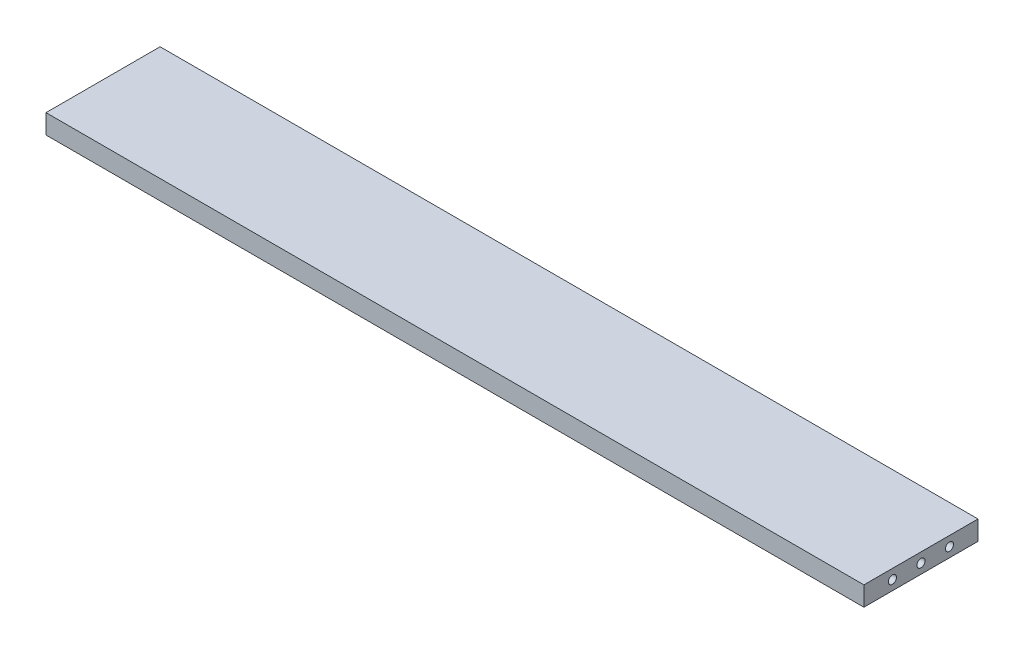
ISO-10303-21;
HEADER;
FILE_DESCRIPTION(('STEP AP214'),'2;1');
FILE_NAME('part.step','',(''),(''),'','','');
FILE_SCHEMA(('AUTOMOTIVE_DESIGN { 1 0 10303 214 1 1 1 1 }'));
ENDSEC;
DATA;
#1=APPLICATION_CONTEXT('core data for automotive mechanical design processes');
#2=APPLICATION_PROTOCOL_DEFINITION('international standard','automotive_design',2000,#1);
#3=PRODUCT_CONTEXT('',#1,'mechanical');
#4=PRODUCT('Part','Part','',(#3));
#5=PRODUCT_RELATED_PRODUCT_CATEGORY('part','',(#4));
#6=PRODUCT_DEFINITION_FORMATION('','',#4);
#7=PRODUCT_DEFINITION_CONTEXT('part definition',#1,'design');
#8=PRODUCT_DEFINITION('design','',#6,#7);
#9=PRODUCT_DEFINITION_SHAPE('','',#8);
#10=(LENGTH_UNIT() NAMED_UNIT(*) SI_UNIT(.MILLI.,.METRE.));
#11=(NAMED_UNIT(*) PLANE_ANGLE_UNIT() SI_UNIT($,.RADIAN.));
#12=(NAMED_UNIT(*) SI_UNIT($,.STERADIAN.) SOLID_ANGLE_UNIT());
#13=UNCERTAINTY_MEASURE_WITH_UNIT(LENGTH_MEASURE(1.E-05),#10,'distance_accuracy_value','');
#14=(GEOMETRIC_REPRESENTATION_CONTEXT(3) GLOBAL_UNCERTAINTY_ASSIGNED_CONTEXT((#13)) GLOBAL_UNIT_ASSIGNED_CONTEXT((#10,
#11,#12)) REPRESENTATION_CONTEXT('',''));
#15=CARTESIAN_POINT('',(0.,0.,0.));
#16=DIRECTION('',(0.,0.,1.));
#17=DIRECTION('',(1.,0.,0.));
#18=AXIS2_PLACEMENT_3D('',#15,#16,#17);
#19=CARTESIAN_POINT('',(-200.715,9.525,-28.));
#20=DIRECTION('',(1.,0.,0.));
#21=DIRECTION('',(0.,0.,-1.));
#22=AXIS2_PLACEMENT_3D('',#19,#20,#21);
#23=PLANE('',#22);
#24=CARTESIAN_POINT('',(-200.715,4.7625,14.));
#25=DIRECTION('',(-1.,0.,0.));
#26=DIRECTION('',(0.,0.,1.));
#27=AXIS2_PLACEMENT_3D('',#24,#25,#26);
#28=CIRCLE('',#27,2.);
#29=CARTESIAN_POINT('',(-200.715,4.7625,16.));
#30=VERTEX_POINT('',#29);
#31=EDGE_CURVE('E138',#30,#30,#28,.T.);
#32=ORIENTED_EDGE('',*,*,#31,.F.);
#33=EDGE_LOOP('',(#32));
#34=FACE_BOUND('',#33,.T.);
#35=CARTESIAN_POINT('',(-200.715,4.7625,0.));
#36=DIRECTION('',(-1.,0.,0.));
#37=DIRECTION('',(0.,0.,1.));
#38=AXIS2_PLACEMENT_3D('',#35,#36,#37);
#39=CIRCLE('',#38,2.);
#40=CARTESIAN_POINT('',(-200.715,4.7625,2.00000000000001));
#41=VERTEX_POINT('',#40);
#42=EDGE_CURVE('E132',#41,#41,#39,.T.);
#43=ORIENTED_EDGE('',*,*,#42,.F.);
#44=EDGE_LOOP('',(#43));
#45=FACE_BOUND('',#44,.T.);
#46=CARTESIAN_POINT('',(-200.715,4.7625,-14.));
#47=DIRECTION('',(-1.,0.,0.));
#48=DIRECTION('',(0.,0.,1.));
#49=AXIS2_PLACEMENT_3D('',#46,#47,#48);
#50=CIRCLE('',#49,2.);
#51=CARTESIAN_POINT('',(-200.715,4.7625,-12.));
#52=VERTEX_POINT('',#51);
#53=EDGE_CURVE('E126',#52,#52,#50,.T.);
#54=ORIENTED_EDGE('',*,*,#53,.F.);
#55=EDGE_LOOP('',(#54));
#56=FACE_BOUND('',#55,.T.);
#57=DIRECTION('',(0.,0.,1.));
#58=VECTOR('',#57,1.);
#59=CARTESIAN_POINT('',(-200.715,0.,-28.));
#60=LINE('',#59,#58);
#61=CARTESIAN_POINT('',(-200.715,0.,-28.));
#62=VERTEX_POINT('',#61);
#63=CARTESIAN_POINT('',(-200.715,0.,28.));
#64=VERTEX_POINT('',#63);
#65=EDGE_CURVE('E94',#62,#64,#60,.T.);
#66=ORIENTED_EDGE('',*,*,#65,.T.);
#67=DIRECTION('',(0.,-1.,0.));
#68=VECTOR('',#67,1.);
#69=CARTESIAN_POINT('',(-200.715,9.525,28.));
#70=LINE('',#69,#68);
#71=CARTESIAN_POINT('',(-200.715,9.525,28.));
#72=VERTEX_POINT('',#71);
#73=EDGE_CURVE('E11',#72,#64,#70,.T.);
#74=ORIENTED_EDGE('',*,*,#73,.F.);
#75=DIRECTION('',(0.,0.,1.));
#76=VECTOR('',#75,1.);
#77=CARTESIAN_POINT('',(-200.715,9.525,-28.));
#78=LINE('',#77,#76);
#79=CARTESIAN_POINT('',(-200.715,9.525,-28.));
#80=VERTEX_POINT('',#79);
#81=EDGE_CURVE('E82',#80,#72,#78,.T.);
#82=ORIENTED_EDGE('',*,*,#81,.F.);
#83=DIRECTION('',(0.,-1.,0.));
#84=VECTOR('',#83,1.);
#85=CARTESIAN_POINT('',(-200.715,9.525,-28.));
#86=LINE('',#85,#84);
#87=EDGE_CURVE('E90',#80,#62,#86,.T.);
#88=ORIENTED_EDGE('',*,*,#87,.T.);
#89=EDGE_LOOP('',(#66,#74,#82,#88));
#90=FACE_BOUND('',#89,.T.);
#91=ADVANCED_FACE('F31',(#34,#45,#56,#90),#23,.F.);
#92=CARTESIAN_POINT('',(-200.715,9.525,28.));
#93=DIRECTION('',(0.,0.,-1.));
#94=DIRECTION('',(-1.,0.,0.));
#95=AXIS2_PLACEMENT_3D('',#92,#93,#94);
#96=PLANE('',#95);
#97=DIRECTION('',(1.,0.,0.));
#98=VECTOR('',#97,1.);
#99=CARTESIAN_POINT('',(-200.715,0.,28.));
#100=LINE('',#99,#98);
#101=CARTESIAN_POINT('',(200.715,0.,28.));
#102=VERTEX_POINT('',#101);
#103=EDGE_CURVE('E86',#64,#102,#100,.T.);
#104=ORIENTED_EDGE('',*,*,#103,.T.);
#105=DIRECTION('',(0.,-1.,0.));
#106=VECTOR('',#105,1.);
#107=CARTESIAN_POINT('',(200.715,9.525,28.));
#108=LINE('',#107,#106);
#109=CARTESIAN_POINT('',(200.715,9.525,28.));
#110=VERTEX_POINT('',#109);
#111=EDGE_CURVE('E39',#110,#102,#108,.T.);
#112=ORIENTED_EDGE('',*,*,#111,.F.);
#113=DIRECTION('',(1.,0.,0.));
#114=VECTOR('',#113,1.);
#115=CARTESIAN_POINT('',(-200.715,9.525,28.));
#116=LINE('',#115,#114);
#117=EDGE_CURVE('E77',#72,#110,#116,.T.);
#118=ORIENTED_EDGE('',*,*,#117,.F.);
#119=ORIENTED_EDGE('',*,*,#73,.T.);
#120=EDGE_LOOP('',(#104,#112,#118,#119));
#121=FACE_BOUND('',#120,.T.);
#122=ADVANCED_FACE('F85',(#121),#96,.F.);
#123=CARTESIAN_POINT('',(200.715,9.525,-28.));
#124=DIRECTION('',(-1.,0.,0.));
#125=DIRECTION('',(0.,0.,1.));
#126=AXIS2_PLACEMENT_3D('',#123,#124,#125);
#127=PLANE('',#126);
#128=CARTESIAN_POINT('',(200.715,4.7625,-14.));
#129=DIRECTION('',(1.,0.,0.));
#130=DIRECTION('',(0.,0.,-1.));
#131=AXIS2_PLACEMENT_3D('',#128,#129,#130);
#132=CIRCLE('',#131,2.);
#133=CARTESIAN_POINT('',(200.715,4.7625,-16.));
#134=VERTEX_POINT('',#133);
#135=EDGE_CURVE('E120',#134,#134,#132,.T.);
#136=ORIENTED_EDGE('',*,*,#135,.F.);
#137=EDGE_LOOP('',(#136));
#138=FACE_BOUND('',#137,.T.);
#139=CARTESIAN_POINT('',(200.715,4.7625,0.));
#140=DIRECTION('',(1.,0.,0.));
#141=DIRECTION('',(0.,0.,-1.));
#142=AXIS2_PLACEMENT_3D('',#139,#140,#141);
#143=CIRCLE('',#142,2.);
#144=CARTESIAN_POINT('',(200.715,4.7625,-1.99999999999999));
#145=VERTEX_POINT('',#144);
#146=EDGE_CURVE('E114',#145,#145,#143,.T.);
#147=ORIENTED_EDGE('',*,*,#146,.F.);
#148=EDGE_LOOP('',(#147));
#149=FACE_BOUND('',#148,.T.);
#150=CARTESIAN_POINT('',(200.715,4.7625,14.));
#151=DIRECTION('',(1.,0.,0.));
#152=DIRECTION('',(0.,0.,-1.));
#153=AXIS2_PLACEMENT_3D('',#150,#151,#152);
#154=CIRCLE('',#153,2.);
#155=CARTESIAN_POINT('',(200.715,4.7625,12.));
#156=VERTEX_POINT('',#155);
#157=EDGE_CURVE('E108',#156,#156,#154,.T.);
#158=ORIENTED_EDGE('',*,*,#157,.F.);
#159=EDGE_LOOP('',(#158));
#160=FACE_BOUND('',#159,.T.);
#161=DIRECTION('',(0.,0.,-1.));
#162=VECTOR('',#161,1.);
#163=CARTESIAN_POINT('',(200.715,0.,-28.));
#164=LINE('',#163,#162);
#165=CARTESIAN_POINT('',(200.715,0.,-28.));
#166=VERTEX_POINT('',#165);
#167=EDGE_CURVE('E64',#102,#166,#164,.T.);
#168=ORIENTED_EDGE('',*,*,#167,.T.);
#169=DIRECTION('',(0.,-1.,0.));
#170=VECTOR('',#169,1.);
#171=CARTESIAN_POINT('',(200.715,9.525,-28.));
#172=LINE('',#171,#170);
#173=CARTESIAN_POINT('',(200.715,9.525,-28.));
#174=VERTEX_POINT('',#173);
#175=EDGE_CURVE('E87',#174,#166,#172,.T.);
#176=ORIENTED_EDGE('',*,*,#175,.F.);
#177=DIRECTION('',(0.,0.,-1.));
#178=VECTOR('',#177,1.);
#179=CARTESIAN_POINT('',(200.715,9.525,-28.));
#180=LINE('',#179,#178);
#181=EDGE_CURVE('E80',#110,#174,#180,.T.);
#182=ORIENTED_EDGE('',*,*,#181,.F.);
#183=ORIENTED_EDGE('',*,*,#111,.T.);
#184=EDGE_LOOP('',(#168,#176,#182,#183));
#185=FACE_BOUND('',#184,.T.);
#186=ADVANCED_FACE('F88',(#138,#149,#160,#185),#127,.F.);
#187=CARTESIAN_POINT('',(-200.715,9.525,-28.));
#188=DIRECTION('',(0.,0.,1.));
#189=DIRECTION('',(1.,0.,0.));
#190=AXIS2_PLACEMENT_3D('',#187,#188,#189);
#191=PLANE('',#190);
#192=DIRECTION('',(-1.,0.,0.));
#193=VECTOR('',#192,1.);
#194=CARTESIAN_POINT('',(-200.715,0.,-28.));
#195=LINE('',#194,#193);
#196=EDGE_CURVE('E70',#166,#62,#195,.T.);
#197=ORIENTED_EDGE('',*,*,#196,.T.);
#198=ORIENTED_EDGE('',*,*,#87,.F.);
#199=DIRECTION('',(-1.,0.,0.));
#200=VECTOR('',#199,1.);
#201=CARTESIAN_POINT('',(-200.715,9.525,-28.));
#202=LINE('',#201,#200);
#203=EDGE_CURVE('E47',#174,#80,#202,.T.);
#204=ORIENTED_EDGE('',*,*,#203,.F.);
#205=ORIENTED_EDGE('',*,*,#175,.T.);
#206=EDGE_LOOP('',(#197,#198,#204,#205));
#207=FACE_BOUND('',#206,.T.);
#208=ADVANCED_FACE('F102',(#207),#191,.F.);
#209=CARTESIAN_POINT('',(-200.715,9.525,28.));
#210=DIRECTION('',(0.,1.,0.));
#211=DIRECTION('',(0.,0.,1.));
#212=AXIS2_PLACEMENT_3D('',#209,#210,#211);
#213=PLANE('',#212);
#214=ORIENTED_EDGE('',*,*,#81,.T.);
#215=ORIENTED_EDGE('',*,*,#117,.T.);
#216=ORIENTED_EDGE('',*,*,#181,.T.);
#217=ORIENTED_EDGE('',*,*,#203,.T.);
#218=EDGE_LOOP('',(#214,#215,#216,#217));
#219=FACE_BOUND('',#218,.T.);
#220=ADVANCED_FACE('F78',(#219),#213,.T.);
#221=CARTESIAN_POINT('',(-200.715,0.,28.));
#222=DIRECTION('',(0.,1.,0.));
#223=DIRECTION('',(0.,0.,1.));
#224=AXIS2_PLACEMENT_3D('',#221,#222,#223);
#225=PLANE('',#224);
#226=ORIENTED_EDGE('',*,*,#65,.F.);
#227=ORIENTED_EDGE('',*,*,#196,.F.);
#228=ORIENTED_EDGE('',*,*,#167,.F.);
#229=ORIENTED_EDGE('',*,*,#103,.F.);
#230=EDGE_LOOP('',(#226,#227,#228,#229));
#231=FACE_BOUND('',#230,.T.);
#232=ADVANCED_FACE('F105',(#231),#225,.F.);
#233=CARTESIAN_POINT('',(170.715,4.7625,14.));
#234=DIRECTION('',(1.,0.,0.));
#235=DIRECTION('',(0.,0.,-1.));
#236=AXIS2_PLACEMENT_3D('',#233,#234,#235);
#237=CYLINDRICAL_SURFACE('',#236,2.);
#238=CARTESIAN_POINT('',(170.715,4.7625,14.));
#239=DIRECTION('',(1.,0.,0.));
#240=DIRECTION('',(0.,0.,-1.));
#241=AXIS2_PLACEMENT_3D('',#238,#239,#240);
#242=CIRCLE('',#241,2.);
#243=CARTESIAN_POINT('',(170.715,4.7625,12.));
#244=VERTEX_POINT('',#243);
#245=EDGE_CURVE('E97',#244,#244,#242,.T.);
#246=ORIENTED_EDGE('',*,*,#245,.F.);
#247=EDGE_LOOP('',(#246));
#248=FACE_BOUND('',#247,.T.);
#249=ORIENTED_EDGE('',*,*,#157,.T.);
#250=EDGE_LOOP('',(#249));
#251=FACE_BOUND('',#250,.T.);
#252=ADVANCED_FACE('F192',(#248,#251),#237,.F.);
#253=CARTESIAN_POINT('',(170.715,4.7625,14.));
#254=DIRECTION('',(1.,0.,0.));
#255=DIRECTION('',(0.,0.,-1.));
#256=AXIS2_PLACEMENT_3D('',#253,#254,#255);
#257=PLANE('',#256);
#258=ORIENTED_EDGE('',*,*,#245,.T.);
#259=EDGE_LOOP('',(#258));
#260=FACE_BOUND('',#259,.T.);
#261=ADVANCED_FACE('F188',(#260),#257,.T.);
#262=CARTESIAN_POINT('',(170.715,4.7625,0.));
#263=DIRECTION('',(1.,0.,0.));
#264=DIRECTION('',(0.,0.,-1.));
#265=AXIS2_PLACEMENT_3D('',#262,#263,#264);
#266=CYLINDRICAL_SURFACE('',#265,2.);
#267=CARTESIAN_POINT('',(170.715,4.7625,0.));
#268=DIRECTION('',(1.,0.,0.));
#269=DIRECTION('',(0.,0.,-1.));
#270=AXIS2_PLACEMENT_3D('',#267,#268,#269);
#271=CIRCLE('',#270,2.);
#272=CARTESIAN_POINT('',(170.715,4.7625,-1.99999999999999));
#273=VERTEX_POINT('',#272);
#274=EDGE_CURVE('E111',#273,#273,#271,.T.);
#275=ORIENTED_EDGE('',*,*,#274,.F.);
#276=EDGE_LOOP('',(#275));
#277=FACE_BOUND('',#276,.T.);
#278=ORIENTED_EDGE('',*,*,#146,.T.);
#279=EDGE_LOOP('',(#278));
#280=FACE_BOUND('',#279,.T.);
#281=ADVANCED_FACE('F184',(#277,#280),#266,.F.);
#282=CARTESIAN_POINT('',(170.715,4.7625,0.));
#283=DIRECTION('',(1.,0.,0.));
#284=DIRECTION('',(0.,0.,-1.));
#285=AXIS2_PLACEMENT_3D('',#282,#283,#284);
#286=PLANE('',#285);
#287=ORIENTED_EDGE('',*,*,#274,.T.);
#288=EDGE_LOOP('',(#287));
#289=FACE_BOUND('',#288,.T.);
#290=ADVANCED_FACE('F180',(#289),#286,.T.);
#291=CARTESIAN_POINT('',(170.715,4.7625,-14.));
#292=DIRECTION('',(1.,0.,0.));
#293=DIRECTION('',(0.,0.,-1.));
#294=AXIS2_PLACEMENT_3D('',#291,#292,#293);
#295=CYLINDRICAL_SURFACE('',#294,2.);
#296=CARTESIAN_POINT('',(170.715,4.7625,-14.));
#297=DIRECTION('',(1.,0.,0.));
#298=DIRECTION('',(0.,0.,-1.));
#299=AXIS2_PLACEMENT_3D('',#296,#297,#298);
#300=CIRCLE('',#299,2.);
#301=CARTESIAN_POINT('',(170.715,4.7625,-16.));
#302=VERTEX_POINT('',#301);
#303=EDGE_CURVE('E117',#302,#302,#300,.T.);
#304=ORIENTED_EDGE('',*,*,#303,.F.);
#305=EDGE_LOOP('',(#304));
#306=FACE_BOUND('',#305,.T.);
#307=ORIENTED_EDGE('',*,*,#135,.T.);
#308=EDGE_LOOP('',(#307));
#309=FACE_BOUND('',#308,.T.);
#310=ADVANCED_FACE('F172',(#306,#309),#295,.F.);
#311=CARTESIAN_POINT('',(170.715,4.7625,-14.));
#312=DIRECTION('',(1.,0.,0.));
#313=DIRECTION('',(0.,0.,-1.));
#314=AXIS2_PLACEMENT_3D('',#311,#312,#313);
#315=PLANE('',#314);
#316=ORIENTED_EDGE('',*,*,#303,.T.);
#317=EDGE_LOOP('',(#316));
#318=FACE_BOUND('',#317,.T.);
#319=ADVANCED_FACE('F162',(#318),#315,.T.);
#320=CARTESIAN_POINT('',(-180.715,4.7625,-14.));
#321=DIRECTION('',(-1.,0.,0.));
#322=DIRECTION('',(0.,0.,1.));
#323=AXIS2_PLACEMENT_3D('',#320,#321,#322);
#324=CYLINDRICAL_SURFACE('',#323,2.);
#325=CARTESIAN_POINT('',(-180.715,4.7625,-14.));
#326=DIRECTION('',(-1.,0.,0.));
#327=DIRECTION('',(0.,0.,1.));
#328=AXIS2_PLACEMENT_3D('',#325,#326,#327);
#329=CIRCLE('',#328,2.);
#330=CARTESIAN_POINT('',(-180.715,4.7625,-12.));
#331=VERTEX_POINT('',#330);
#332=EDGE_CURVE('E123',#331,#331,#329,.T.);
#333=ORIENTED_EDGE('',*,*,#332,.F.);
#334=EDGE_LOOP('',(#333));
#335=FACE_BOUND('',#334,.T.);
#336=ORIENTED_EDGE('',*,*,#53,.T.);
#337=EDGE_LOOP('',(#336));
#338=FACE_BOUND('',#337,.T.);
#339=ADVANCED_FACE('F159',(#335,#338),#324,.F.);
#340=CARTESIAN_POINT('',(-180.715,4.7625,-14.));
#341=DIRECTION('',(-1.,0.,0.));
#342=DIRECTION('',(0.,0.,1.));
#343=AXIS2_PLACEMENT_3D('',#340,#341,#342);
#344=PLANE('',#343);
#345=ORIENTED_EDGE('',*,*,#332,.T.);
#346=EDGE_LOOP('',(#345));
#347=FACE_BOUND('',#346,.T.);
#348=ADVANCED_FACE('F161',(#347),#344,.T.);
#349=CARTESIAN_POINT('',(-180.715,4.7625,0.));
#350=DIRECTION('',(-1.,0.,0.));
#351=DIRECTION('',(0.,0.,1.));
#352=AXIS2_PLACEMENT_3D('',#349,#350,#351);
#353=CYLINDRICAL_SURFACE('',#352,2.);
#354=CARTESIAN_POINT('',(-180.715,4.7625,0.));
#355=DIRECTION('',(-1.,0.,0.));
#356=DIRECTION('',(0.,0.,1.));
#357=AXIS2_PLACEMENT_3D('',#354,#355,#356);
#358=CIRCLE('',#357,2.);
#359=CARTESIAN_POINT('',(-180.715,4.7625,2.00000000000001));
#360=VERTEX_POINT('',#359);
#361=EDGE_CURVE('E129',#360,#360,#358,.T.);
#362=ORIENTED_EDGE('',*,*,#361,.F.);
#363=EDGE_LOOP('',(#362));
#364=FACE_BOUND('',#363,.T.);
#365=ORIENTED_EDGE('',*,*,#42,.T.);
#366=EDGE_LOOP('',(#365));
#367=FACE_BOUND('',#366,.T.);
#368=ADVANCED_FACE('F169',(#364,#367),#353,.F.);
#369=CARTESIAN_POINT('',(-180.715,4.7625,0.));
#370=DIRECTION('',(-1.,0.,0.));
#371=DIRECTION('',(0.,0.,1.));
#372=AXIS2_PLACEMENT_3D('',#369,#370,#371);
#373=PLANE('',#372);
#374=ORIENTED_EDGE('',*,*,#361,.T.);
#375=EDGE_LOOP('',(#374));
#376=FACE_BOUND('',#375,.T.);
#377=ADVANCED_FACE('F149',(#376),#373,.T.);
#378=CARTESIAN_POINT('',(-180.715,4.7625,14.));
#379=DIRECTION('',(-1.,0.,0.));
#380=DIRECTION('',(0.,0.,1.));
#381=AXIS2_PLACEMENT_3D('',#378,#379,#380);
#382=CYLINDRICAL_SURFACE('',#381,2.);
#383=CARTESIAN_POINT('',(-180.715,4.7625,14.));
#384=DIRECTION('',(-1.,0.,0.));
#385=DIRECTION('',(0.,0.,1.));
#386=AXIS2_PLACEMENT_3D('',#383,#384,#385);
#387=CIRCLE('',#386,2.);
#388=CARTESIAN_POINT('',(-180.715,4.7625,16.));
#389=VERTEX_POINT('',#388);
#390=EDGE_CURVE('E135',#389,#389,#387,.T.);
#391=ORIENTED_EDGE('',*,*,#390,.F.);
#392=EDGE_LOOP('',(#391));
#393=FACE_BOUND('',#392,.T.);
#394=ORIENTED_EDGE('',*,*,#31,.T.);
#395=EDGE_LOOP('',(#394));
#396=FACE_BOUND('',#395,.T.);
#397=ADVANCED_FACE('F146',(#393,#396),#382,.F.);
#398=CARTESIAN_POINT('',(-180.715,4.7625,14.));
#399=DIRECTION('',(-1.,0.,0.));
#400=DIRECTION('',(0.,0.,1.));
#401=AXIS2_PLACEMENT_3D('',#398,#399,#400);
#402=PLANE('',#401);
#403=ORIENTED_EDGE('',*,*,#390,.T.);
#404=EDGE_LOOP('',(#403));
#405=FACE_BOUND('',#404,.T.);
#406=ADVANCED_FACE('F144',(#405),#402,.T.);
#407=CLOSED_SHELL('',(#91,#122,#186,#208,#220,#232,#252,#261,#281,#290,#310,#319,#339,#348,#368,
#377,#397,#406));
#408=MANIFOLD_SOLID_BREP('B2',#407);
#409=ADVANCED_BREP_SHAPE_REPRESENTATION('',(#18,#408),#14);
#410=SHAPE_DEFINITION_REPRESENTATION(#9,#409);
ENDSEC;
END-ISO-10303-21;
